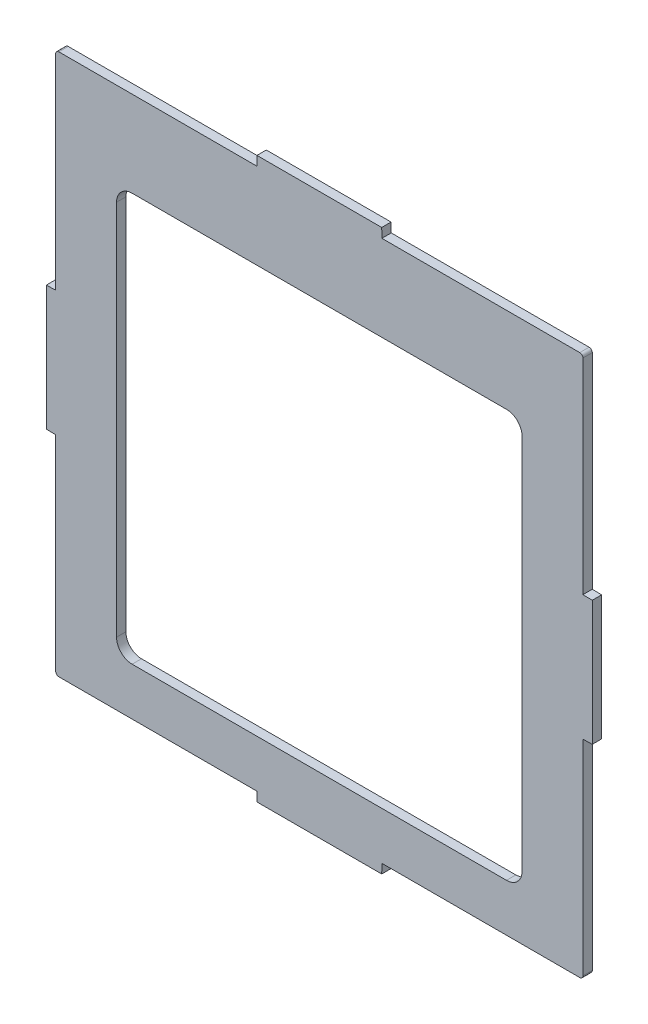
ISO-10303-21;
HEADER;
FILE_DESCRIPTION(('STEP AP214'),'2;1');
FILE_NAME('part.step','',(''),(''),'','','');
FILE_SCHEMA(('AUTOMOTIVE_DESIGN { 1 0 10303 214 1 1 1 1 }'));
ENDSEC;
DATA;
#1=APPLICATION_CONTEXT('core data for automotive mechanical design processes');
#2=APPLICATION_PROTOCOL_DEFINITION('international standard','automotive_design',2000,#1);
#3=PRODUCT_CONTEXT('',#1,'mechanical');
#4=PRODUCT('Part','Part','',(#3));
#5=PRODUCT_RELATED_PRODUCT_CATEGORY('part','',(#4));
#6=PRODUCT_DEFINITION_FORMATION('','',#4);
#7=PRODUCT_DEFINITION_CONTEXT('part definition',#1,'design');
#8=PRODUCT_DEFINITION('design','',#6,#7);
#9=PRODUCT_DEFINITION_SHAPE('','',#8);
#10=(LENGTH_UNIT() NAMED_UNIT(*) SI_UNIT(.MILLI.,.METRE.));
#11=(NAMED_UNIT(*) PLANE_ANGLE_UNIT() SI_UNIT($,.RADIAN.));
#12=(NAMED_UNIT(*) SI_UNIT($,.STERADIAN.) SOLID_ANGLE_UNIT());
#13=UNCERTAINTY_MEASURE_WITH_UNIT(LENGTH_MEASURE(1.E-05),#10,'distance_accuracy_value','');
#14=(GEOMETRIC_REPRESENTATION_CONTEXT(3) GLOBAL_UNCERTAINTY_ASSIGNED_CONTEXT((#13)) GLOBAL_UNIT_ASSIGNED_CONTEXT((#10,
#11,#12)) REPRESENTATION_CONTEXT('',''));
#15=CARTESIAN_POINT('',(0.,0.,0.));
#16=DIRECTION('',(0.,0.,1.));
#17=DIRECTION('',(1.,0.,0.));
#18=AXIS2_PLACEMENT_3D('',#15,#16,#17);
#19=CARTESIAN_POINT('',(739.003337175811,0.,6.));
#20=DIRECTION('',(-1.,0.,0.));
#21=DIRECTION('',(0.,0.,1.));
#22=AXIS2_PLACEMENT_3D('',#19,#20,#21);
#23=PLANE('',#22);
#24=DIRECTION('',(0.,1.,0.));
#25=VECTOR('',#24,1.);
#26=CARTESIAN_POINT('',(739.003337175811,0.,0.));
#27=LINE('',#26,#25);
#28=CARTESIAN_POINT('',(739.003337175811,714.678831377017,0.));
#29=VERTEX_POINT('',#28);
#30=CARTESIAN_POINT('',(739.003337175811,846.078865377017,0.));
#31=VERTEX_POINT('',#30);
#32=EDGE_CURVE('E400',#29,#31,#27,.T.);
#33=ORIENTED_EDGE('',*,*,#32,.T.);
#34=DIRECTION('',(0.,0.,-1.));
#35=VECTOR('',#34,1.);
#36=CARTESIAN_POINT('',(739.003337175811,846.078865377017,6.));
#37=LINE('',#36,#35);
#38=CARTESIAN_POINT('',(739.003337175811,846.078865377017,6.));
#39=VERTEX_POINT('',#38);
#40=EDGE_CURVE('E428',#39,#31,#37,.T.);
#41=ORIENTED_EDGE('',*,*,#40,.F.);
#42=DIRECTION('',(0.,1.,0.));
#43=VECTOR('',#42,1.);
#44=CARTESIAN_POINT('',(739.003337175811,0.,6.));
#45=LINE('',#44,#43);
#46=CARTESIAN_POINT('',(739.003337175811,714.678831377017,6.));
#47=VERTEX_POINT('',#46);
#48=EDGE_CURVE('E334',#47,#39,#45,.T.);
#49=ORIENTED_EDGE('',*,*,#48,.F.);
#50=DIRECTION('',(0.,0.,-1.));
#51=VECTOR('',#50,1.);
#52=CARTESIAN_POINT('',(739.003337175811,714.678831377017,6.));
#53=LINE('',#52,#51);
#54=EDGE_CURVE('E354',#47,#29,#53,.T.);
#55=ORIENTED_EDGE('',*,*,#54,.T.);
#56=EDGE_LOOP('',(#33,#41,#49,#55));
#57=FACE_BOUND('',#56,.T.);
#58=ADVANCED_FACE('F35',(#57),#23,.F.);
#59=CARTESIAN_POINT('',(737.003337175811,846.078865377017,6.));
#60=DIRECTION('',(0.,0.,-1.));
#61=DIRECTION('',(-1.,0.,0.));
#62=AXIS2_PLACEMENT_3D('',#59,#60,#61);
#63=CYLINDRICAL_SURFACE('',#62,2.);
#64=CARTESIAN_POINT('',(737.003337175811,846.078865377017,0.));
#65=DIRECTION('',(0.,0.,1.));
#66=DIRECTION('',(1.,0.,0.));
#67=AXIS2_PLACEMENT_3D('',#64,#65,#66);
#68=CIRCLE('',#67,2.);
#69=CARTESIAN_POINT('',(737.003337175811,848.078865377017,0.));
#70=VERTEX_POINT('',#69);
#71=EDGE_CURVE('E398',#31,#70,#68,.T.);
#72=ORIENTED_EDGE('',*,*,#71,.T.);
#73=DIRECTION('',(0.,0.,-1.));
#74=VECTOR('',#73,1.);
#75=CARTESIAN_POINT('',(737.003337175811,848.078865377017,6.));
#76=LINE('',#75,#74);
#77=CARTESIAN_POINT('',(737.003337175811,848.078865377017,6.));
#78=VERTEX_POINT('',#77);
#79=EDGE_CURVE('E431',#78,#70,#76,.T.);
#80=ORIENTED_EDGE('',*,*,#79,.F.);
#81=CARTESIAN_POINT('',(737.003337175811,846.078865377017,6.));
#82=DIRECTION('',(0.,0.,1.));
#83=DIRECTION('',(1.,0.,0.));
#84=AXIS2_PLACEMENT_3D('',#81,#82,#83);
#85=CIRCLE('',#84,2.);
#86=EDGE_CURVE('E332',#39,#78,#85,.T.);
#87=ORIENTED_EDGE('',*,*,#86,.F.);
#88=ORIENTED_EDGE('',*,*,#40,.T.);
#89=EDGE_LOOP('',(#72,#80,#87,#88));
#90=FACE_BOUND('',#89,.T.);
#91=ADVANCED_FACE('F518',(#90),#63,.T.);
#92=CARTESIAN_POINT('',(0.,848.078865377017,6.));
#93=DIRECTION('',(0.,-1.,0.));
#94=DIRECTION('',(0.,0.,-1.));
#95=AXIS2_PLACEMENT_3D('',#92,#93,#94);
#96=PLANE('',#95);
#97=DIRECTION('',(-1.,0.,0.));
#98=VECTOR('',#97,1.);
#99=CARTESIAN_POINT('',(0.,848.078865377017,0.));
#100=LINE('',#99,#98);
#101=CARTESIAN_POINT('',(610.103337175811,848.078865377017,0.));
#102=VERTEX_POINT('',#101);
#103=EDGE_CURVE('E396',#70,#102,#100,.T.);
#104=ORIENTED_EDGE('',*,*,#103,.T.);
#105=DIRECTION('',(0.,0.,-1.));
#106=VECTOR('',#105,1.);
#107=CARTESIAN_POINT('',(610.103337175811,848.078865377017,6.));
#108=LINE('',#107,#106);
#109=CARTESIAN_POINT('',(610.103337175811,848.078865377017,6.));
#110=VERTEX_POINT('',#109);
#111=EDGE_CURVE('E434',#110,#102,#108,.T.);
#112=ORIENTED_EDGE('',*,*,#111,.F.);
#113=DIRECTION('',(-1.,0.,0.));
#114=VECTOR('',#113,1.);
#115=CARTESIAN_POINT('',(0.,848.078865377017,6.));
#116=LINE('',#115,#114);
#117=EDGE_CURVE('E330',#78,#110,#116,.T.);
#118=ORIENTED_EDGE('',*,*,#117,.F.);
#119=ORIENTED_EDGE('',*,*,#79,.T.);
#120=EDGE_LOOP('',(#104,#112,#118,#119));
#121=FACE_BOUND('',#120,.T.);
#122=ADVANCED_FACE('F523',(#121),#96,.F.);
#123=CARTESIAN_POINT('',(624.064633644969,10.4010772274144,6.));
#124=DIRECTION('',(-0.9998611400396,-0.0166643523339906,0.));
#125=DIRECTION('',(0.0166643523339906,-0.9998611400396,0.));
#126=AXIS2_PLACEMENT_3D('',#123,#124,#125);
#127=PLANE('',#126);
#128=DIRECTION('',(-0.0166643523339906,0.9998611400396,0.));
#129=VECTOR('',#128,1.);
#130=CARTESIAN_POINT('',(624.064633644969,10.4010772274144,0.));
#131=LINE('',#130,#129);
#132=CARTESIAN_POINT('',(610.003337175811,854.078865377017,0.));
#133=VERTEX_POINT('',#132);
#134=EDGE_CURVE('E393',#102,#133,#131,.T.);
#135=ORIENTED_EDGE('',*,*,#134,.T.);
#136=DIRECTION('',(0.,0.,-1.));
#137=VECTOR('',#136,1.);
#138=CARTESIAN_POINT('',(610.003337175811,854.078865377017,6.));
#139=LINE('',#138,#137);
#140=CARTESIAN_POINT('',(610.003337175811,854.078865377017,6.));
#141=VERTEX_POINT('',#140);
#142=EDGE_CURVE('E437',#141,#133,#139,.T.);
#143=ORIENTED_EDGE('',*,*,#142,.F.);
#144=DIRECTION('',(-0.0166643523339906,0.9998611400396,0.));
#145=VECTOR('',#144,1.);
#146=CARTESIAN_POINT('',(624.064633644969,10.4010772274144,6.));
#147=LINE('',#146,#145);
#148=EDGE_CURVE('E328',#110,#141,#147,.T.);
#149=ORIENTED_EDGE('',*,*,#148,.F.);
#150=ORIENTED_EDGE('',*,*,#111,.T.);
#151=EDGE_LOOP('',(#135,#143,#149,#150));
#152=FACE_BOUND('',#151,.T.);
#153=ADVANCED_FACE('F531',(#152),#127,.F.);
#154=CARTESIAN_POINT('',(0.,854.078865377017,6.));
#155=DIRECTION('',(0.,1.,0.));
#156=DIRECTION('',(0.,0.,1.));
#157=AXIS2_PLACEMENT_3D('',#154,#155,#156);
#158=PLANE('',#157);
#159=DIRECTION('',(1.,0.,0.));
#160=VECTOR('',#159,1.);
#161=CARTESIAN_POINT('',(0.,854.078865377017,0.));
#162=LINE('',#161,#160);
#163=CARTESIAN_POINT('',(530.003337175811,854.078865377017,0.));
#164=VERTEX_POINT('',#163);
#165=EDGE_CURVE('E390',#164,#133,#162,.T.);
#166=ORIENTED_EDGE('',*,*,#165,.F.);
#167=DIRECTION('',(0.,0.,-1.));
#168=VECTOR('',#167,1.);
#169=CARTESIAN_POINT('',(530.003337175811,854.078865377017,6.));
#170=LINE('',#169,#168);
#171=CARTESIAN_POINT('',(530.003337175811,854.078865377017,6.));
#172=VERTEX_POINT('',#171);
#173=EDGE_CURVE('E439',#172,#164,#170,.T.);
#174=ORIENTED_EDGE('',*,*,#173,.F.);
#175=DIRECTION('',(1.,0.,0.));
#176=VECTOR('',#175,1.);
#177=CARTESIAN_POINT('',(0.,854.078865377017,6.));
#178=LINE('',#177,#176);
#179=EDGE_CURVE('E325',#172,#141,#178,.T.);
#180=ORIENTED_EDGE('',*,*,#179,.T.);
#181=ORIENTED_EDGE('',*,*,#142,.T.);
#182=EDGE_LOOP('',(#166,#174,#180,#181));
#183=FACE_BOUND('',#182,.T.);
#184=ADVANCED_FACE('F535',(#183),#158,.T.);
#185=CARTESIAN_POINT('',(515.625460125003,-8.59375766877724,6.));
#186=DIRECTION('',(0.999861140039599,-0.016664352334046,0.));
#187=DIRECTION('',(0.016664352334046,0.999861140039599,0.));
#188=AXIS2_PLACEMENT_3D('',#185,#186,#187);
#189=PLANE('',#188);
#190=DIRECTION('',(-0.016664352334046,-0.999861140039599,0.));
#191=VECTOR('',#190,1.);
#192=CARTESIAN_POINT('',(515.625460125003,-8.59375766877724,0.));
#193=LINE('',#192,#191);
#194=CARTESIAN_POINT('',(529.903337175811,848.078865377017,0.));
#195=VERTEX_POINT('',#194);
#196=EDGE_CURVE('E388',#164,#195,#193,.T.);
#197=ORIENTED_EDGE('',*,*,#196,.T.);
#198=DIRECTION('',(0.,0.,-1.));
#199=VECTOR('',#198,1.);
#200=CARTESIAN_POINT('',(529.903337175811,848.078865377017,6.));
#201=LINE('',#200,#199);
#202=CARTESIAN_POINT('',(529.903337175811,848.078865377017,6.));
#203=VERTEX_POINT('',#202);
#204=EDGE_CURVE('E441',#203,#195,#201,.T.);
#205=ORIENTED_EDGE('',*,*,#204,.F.);
#206=DIRECTION('',(-0.016664352334046,-0.999861140039599,0.));
#207=VECTOR('',#206,1.);
#208=CARTESIAN_POINT('',(515.625460125003,-8.59375766877724,6.));
#209=LINE('',#208,#207);
#210=EDGE_CURVE('E323',#172,#203,#209,.T.);
#211=ORIENTED_EDGE('',*,*,#210,.F.);
#212=ORIENTED_EDGE('',*,*,#173,.T.);
#213=EDGE_LOOP('',(#197,#205,#211,#212));
#214=FACE_BOUND('',#213,.T.);
#215=ADVANCED_FACE('F539',(#214),#189,.F.);
#216=CARTESIAN_POINT('',(0.,848.078865377017,6.));
#217=DIRECTION('',(0.,-1.,0.));
#218=DIRECTION('',(0.,0.,-1.));
#219=AXIS2_PLACEMENT_3D('',#216,#217,#218);
#220=PLANE('',#219);
#221=DIRECTION('',(-1.,0.,0.));
#222=VECTOR('',#221,1.);
#223=CARTESIAN_POINT('',(0.,848.078865377017,0.));
#224=LINE('',#223,#222);
#225=CARTESIAN_POINT('',(403.003337175811,848.078865377017,0.));
#226=VERTEX_POINT('',#225);
#227=EDGE_CURVE('E386',#195,#226,#224,.T.);
#228=ORIENTED_EDGE('',*,*,#227,.T.);
#229=DIRECTION('',(0.,0.,-1.));
#230=VECTOR('',#229,1.);
#231=CARTESIAN_POINT('',(403.003337175811,848.078865377017,6.));
#232=LINE('',#231,#230);
#233=CARTESIAN_POINT('',(403.003337175811,848.078865377017,6.));
#234=VERTEX_POINT('',#233);
#235=EDGE_CURVE('E444',#234,#226,#232,.T.);
#236=ORIENTED_EDGE('',*,*,#235,.F.);
#237=DIRECTION('',(-1.,0.,0.));
#238=VECTOR('',#237,1.);
#239=CARTESIAN_POINT('',(0.,848.078865377017,6.));
#240=LINE('',#239,#238);
#241=EDGE_CURVE('E321',#203,#234,#240,.T.);
#242=ORIENTED_EDGE('',*,*,#241,.F.);
#243=ORIENTED_EDGE('',*,*,#204,.T.);
#244=EDGE_LOOP('',(#228,#236,#242,#243));
#245=FACE_BOUND('',#244,.T.);
#246=ADVANCED_FACE('F543',(#245),#220,.F.);
#247=CARTESIAN_POINT('',(403.003337175811,846.078865377017,6.));
#248=DIRECTION('',(0.,0.,-1.));
#249=DIRECTION('',(-1.,0.,0.));
#250=AXIS2_PLACEMENT_3D('',#247,#248,#249);
#251=CYLINDRICAL_SURFACE('',#250,2.00000000000003);
#252=CARTESIAN_POINT('',(403.003337175811,846.078865377017,0.));
#253=DIRECTION('',(0.,0.,1.));
#254=DIRECTION('',(1.,0.,0.));
#255=AXIS2_PLACEMENT_3D('',#252,#253,#254);
#256=CIRCLE('',#255,2.00000000000003);
#257=CARTESIAN_POINT('',(401.003337175811,846.078865377017,0.));
#258=VERTEX_POINT('',#257);
#259=EDGE_CURVE('E384',#226,#258,#256,.T.);
#260=ORIENTED_EDGE('',*,*,#259,.T.);
#261=DIRECTION('',(0.,0.,-1.));
#262=VECTOR('',#261,1.);
#263=CARTESIAN_POINT('',(401.003337175811,846.078865377017,6.));
#264=LINE('',#263,#262);
#265=CARTESIAN_POINT('',(401.003337175811,846.078865377017,6.));
#266=VERTEX_POINT('',#265);
#267=EDGE_CURVE('E447',#266,#258,#264,.T.);
#268=ORIENTED_EDGE('',*,*,#267,.F.);
#269=CARTESIAN_POINT('',(403.003337175811,846.078865377017,6.));
#270=DIRECTION('',(0.,0.,1.));
#271=DIRECTION('',(1.,0.,0.));
#272=AXIS2_PLACEMENT_3D('',#269,#270,#271);
#273=CIRCLE('',#272,2.00000000000003);
#274=EDGE_CURVE('E319',#234,#266,#273,.T.);
#275=ORIENTED_EDGE('',*,*,#274,.F.);
#276=ORIENTED_EDGE('',*,*,#235,.T.);
#277=EDGE_LOOP('',(#260,#268,#275,#276));
#278=FACE_BOUND('',#277,.T.);
#279=ADVANCED_FACE('F547',(#278),#251,.T.);
#280=CARTESIAN_POINT('',(401.003337175811,0.,6.));
#281=DIRECTION('',(1.,0.,0.));
#282=DIRECTION('',(0.,0.,-1.));
#283=AXIS2_PLACEMENT_3D('',#280,#281,#282);
#284=PLANE('',#283);
#285=DIRECTION('',(0.,-1.,0.));
#286=VECTOR('',#285,1.);
#287=CARTESIAN_POINT('',(401.003337175811,0.,0.));
#288=LINE('',#287,#286);
#289=CARTESIAN_POINT('',(401.003337175811,714.678831377017,0.));
#290=VERTEX_POINT('',#289);
#291=EDGE_CURVE('E382',#258,#290,#288,.T.);
#292=ORIENTED_EDGE('',*,*,#291,.T.);
#293=DIRECTION('',(0.,0.,-1.));
#294=VECTOR('',#293,1.);
#295=CARTESIAN_POINT('',(401.003337175811,714.678831377017,6.));
#296=LINE('',#295,#294);
#297=CARTESIAN_POINT('',(401.003337175811,714.678831377017,6.));
#298=VERTEX_POINT('',#297);
#299=EDGE_CURVE('E450',#298,#290,#296,.T.);
#300=ORIENTED_EDGE('',*,*,#299,.F.);
#301=DIRECTION('',(0.,-1.,0.));
#302=VECTOR('',#301,1.);
#303=CARTESIAN_POINT('',(401.003337175811,0.,6.));
#304=LINE('',#303,#302);
#305=EDGE_CURVE('E317',#266,#298,#304,.T.);
#306=ORIENTED_EDGE('',*,*,#305,.F.);
#307=ORIENTED_EDGE('',*,*,#267,.T.);
#308=EDGE_LOOP('',(#292,#300,#306,#307));
#309=FACE_BOUND('',#308,.T.);
#310=ADVANCED_FACE('F551',(#309),#284,.F.);
#311=CARTESIAN_POINT('',(-11.7966471939575,707.798831637521,6.));
#312=DIRECTION('',(0.0166643523339916,-0.9998611400396,0.));
#313=DIRECTION('',(0.9998611400396,0.0166643523339916,0.));
#314=AXIS2_PLACEMENT_3D('',#311,#312,#313);
#315=PLANE('',#314);
#316=DIRECTION('',(-0.9998611400396,-0.0166643523339916,0.));
#317=VECTOR('',#316,1.);
#318=CARTESIAN_POINT('',(-11.7966471939575,707.798831637521,0.));
#319=LINE('',#318,#317);
#320=CARTESIAN_POINT('',(395.003337175811,714.578831377017,0.));
#321=VERTEX_POINT('',#320);
#322=EDGE_CURVE('E380',#290,#321,#319,.T.);
#323=ORIENTED_EDGE('',*,*,#322,.T.);
#324=DIRECTION('',(0.,0.,-1.));
#325=VECTOR('',#324,1.);
#326=CARTESIAN_POINT('',(395.003337175811,714.578831377017,6.));
#327=LINE('',#326,#325);
#328=CARTESIAN_POINT('',(395.003337175811,714.578831377017,6.));
#329=VERTEX_POINT('',#328);
#330=EDGE_CURVE('E453',#329,#321,#327,.T.);
#331=ORIENTED_EDGE('',*,*,#330,.F.);
#332=DIRECTION('',(-0.9998611400396,-0.0166643523339916,0.));
#333=VECTOR('',#332,1.);
#334=CARTESIAN_POINT('',(-11.7966471939575,707.798831637521,6.));
#335=LINE('',#334,#333);
#336=EDGE_CURVE('E315',#298,#329,#335,.T.);
#337=ORIENTED_EDGE('',*,*,#336,.F.);
#338=ORIENTED_EDGE('',*,*,#299,.T.);
#339=EDGE_LOOP('',(#323,#331,#337,#338));
#340=FACE_BOUND('',#339,.T.);
#341=ADVANCED_FACE('F555',(#340),#315,.F.);
#342=CARTESIAN_POINT('',(395.003337175811,0.,6.));
#343=DIRECTION('',(1.,0.,0.));
#344=DIRECTION('',(0.,0.,-1.));
#345=AXIS2_PLACEMENT_3D('',#342,#343,#344);
#346=PLANE('',#345);
#347=DIRECTION('',(0.,-1.,0.));
#348=VECTOR('',#347,1.);
#349=CARTESIAN_POINT('',(395.003337175811,0.,0.));
#350=LINE('',#349,#348);
#351=CARTESIAN_POINT('',(395.003337175812,634.578831377017,0.));
#352=VERTEX_POINT('',#351);
#353=EDGE_CURVE('E378',#321,#352,#350,.T.);
#354=ORIENTED_EDGE('',*,*,#353,.T.);
#355=DIRECTION('',(0.,0.,-1.));
#356=VECTOR('',#355,1.);
#357=CARTESIAN_POINT('',(395.003337175812,634.578831377017,6.));
#358=LINE('',#357,#356);
#359=CARTESIAN_POINT('',(395.003337175812,634.578831377017,6.));
#360=VERTEX_POINT('',#359);
#361=EDGE_CURVE('E456',#360,#352,#358,.T.);
#362=ORIENTED_EDGE('',*,*,#361,.F.);
#363=DIRECTION('',(0.,-1.,0.));
#364=VECTOR('',#363,1.);
#365=CARTESIAN_POINT('',(395.003337175811,0.,6.));
#366=LINE('',#365,#364);
#367=EDGE_CURVE('E313',#329,#360,#366,.T.);
#368=ORIENTED_EDGE('',*,*,#367,.F.);
#369=ORIENTED_EDGE('',*,*,#330,.T.);
#370=EDGE_LOOP('',(#354,#362,#368,#369));
#371=FACE_BOUND('',#370,.T.);
#372=ADVANCED_FACE('F559',(#371),#346,.F.);
#373=CARTESIAN_POINT('',(10.6830694861963,640.984169171843,6.));
#374=DIRECTION('',(0.0166643523339916,0.9998611400396,0.));
#375=DIRECTION('',(-0.9998611400396,0.0166643523339916,0.));
#376=AXIS2_PLACEMENT_3D('',#373,#374,#375);
#377=PLANE('',#376);
#378=DIRECTION('',(0.9998611400396,-0.0166643523339916,0.));
#379=VECTOR('',#378,1.);
#380=CARTESIAN_POINT('',(10.6830694861963,640.984169171843,0.));
#381=LINE('',#380,#379);
#382=CARTESIAN_POINT('',(401.003337175811,634.478831377017,0.));
#383=VERTEX_POINT('',#382);
#384=EDGE_CURVE('E376',#352,#383,#381,.T.);
#385=ORIENTED_EDGE('',*,*,#384,.T.);
#386=DIRECTION('',(0.,0.,-1.));
#387=VECTOR('',#386,1.);
#388=CARTESIAN_POINT('',(401.003337175811,634.478831377017,6.));
#389=LINE('',#388,#387);
#390=CARTESIAN_POINT('',(401.003337175811,634.478831377017,6.));
#391=VERTEX_POINT('',#390);
#392=EDGE_CURVE('E459',#391,#383,#389,.T.);
#393=ORIENTED_EDGE('',*,*,#392,.F.);
#394=DIRECTION('',(0.9998611400396,-0.0166643523339916,0.));
#395=VECTOR('',#394,1.);
#396=CARTESIAN_POINT('',(10.6830694861963,640.984169171843,6.));
#397=LINE('',#396,#395);
#398=EDGE_CURVE('E311',#360,#391,#397,.T.);
#399=ORIENTED_EDGE('',*,*,#398,.F.);
#400=ORIENTED_EDGE('',*,*,#361,.T.);
#401=EDGE_LOOP('',(#385,#393,#399,#400));
#402=FACE_BOUND('',#401,.T.);
#403=ADVANCED_FACE('F563',(#402),#377,.F.);
#404=CARTESIAN_POINT('',(401.003337175811,0.,6.));
#405=DIRECTION('',(1.,0.,0.));
#406=DIRECTION('',(0.,0.,-1.));
#407=AXIS2_PLACEMENT_3D('',#404,#405,#406);
#408=PLANE('',#407);
#409=DIRECTION('',(0.,-1.,0.));
#410=VECTOR('',#409,1.);
#411=CARTESIAN_POINT('',(401.003337175811,0.,0.));
#412=LINE('',#411,#410);
#413=CARTESIAN_POINT('',(401.003337175811,503.078865377017,0.));
#414=VERTEX_POINT('',#413);
#415=EDGE_CURVE('E374',#383,#414,#412,.T.);
#416=ORIENTED_EDGE('',*,*,#415,.T.);
#417=DIRECTION('',(0.,0.,-1.));
#418=VECTOR('',#417,1.);
#419=CARTESIAN_POINT('',(401.003337175811,503.078865377017,6.));
#420=LINE('',#419,#418);
#421=CARTESIAN_POINT('',(401.003337175811,503.078865377017,6.));
#422=VERTEX_POINT('',#421);
#423=EDGE_CURVE('E462',#422,#414,#420,.T.);
#424=ORIENTED_EDGE('',*,*,#423,.F.);
#425=DIRECTION('',(0.,-1.,0.));
#426=VECTOR('',#425,1.);
#427=CARTESIAN_POINT('',(401.003337175811,0.,6.));
#428=LINE('',#427,#426);
#429=EDGE_CURVE('E309',#391,#422,#428,.T.);
#430=ORIENTED_EDGE('',*,*,#429,.F.);
#431=ORIENTED_EDGE('',*,*,#392,.T.);
#432=EDGE_LOOP('',(#416,#424,#430,#431));
#433=FACE_BOUND('',#432,.T.);
#434=ADVANCED_FACE('F567',(#433),#408,.F.);
#435=CARTESIAN_POINT('',(403.003337175811,503.078865377017,6.));
#436=DIRECTION('',(0.,0.,-1.));
#437=DIRECTION('',(-1.,0.,0.));
#438=AXIS2_PLACEMENT_3D('',#435,#436,#437);
#439=CYLINDRICAL_SURFACE('',#438,2.);
#440=CARTESIAN_POINT('',(403.003337175811,503.078865377017,0.));
#441=DIRECTION('',(0.,0.,1.));
#442=DIRECTION('',(1.,0.,0.));
#443=AXIS2_PLACEMENT_3D('',#440,#441,#442);
#444=CIRCLE('',#443,2.);
#445=CARTESIAN_POINT('',(403.003337175811,501.078865377017,0.));
#446=VERTEX_POINT('',#445);
#447=EDGE_CURVE('E372',#414,#446,#444,.T.);
#448=ORIENTED_EDGE('',*,*,#447,.T.);
#449=DIRECTION('',(0.,0.,-1.));
#450=VECTOR('',#449,1.);
#451=CARTESIAN_POINT('',(403.003337175811,501.078865377017,6.));
#452=LINE('',#451,#450);
#453=CARTESIAN_POINT('',(403.003337175811,501.078865377017,6.));
#454=VERTEX_POINT('',#453);
#455=EDGE_CURVE('E465',#454,#446,#452,.T.);
#456=ORIENTED_EDGE('',*,*,#455,.F.);
#457=CARTESIAN_POINT('',(403.003337175811,503.078865377017,6.));
#458=DIRECTION('',(0.,0.,1.));
#459=DIRECTION('',(1.,0.,0.));
#460=AXIS2_PLACEMENT_3D('',#457,#458,#459);
#461=CIRCLE('',#460,2.);
#462=EDGE_CURVE('E307',#422,#454,#461,.T.);
#463=ORIENTED_EDGE('',*,*,#462,.F.);
#464=ORIENTED_EDGE('',*,*,#423,.T.);
#465=EDGE_LOOP('',(#448,#456,#463,#464));
#466=FACE_BOUND('',#465,.T.);
#467=ADVANCED_FACE('F571',(#466),#439,.T.);
#468=CARTESIAN_POINT('',(0.,501.078865377017,6.));
#469=DIRECTION('',(0.,1.,0.));
#470=DIRECTION('',(0.,0.,1.));
#471=AXIS2_PLACEMENT_3D('',#468,#469,#470);
#472=PLANE('',#471);
#473=DIRECTION('',(1.,0.,0.));
#474=VECTOR('',#473,1.);
#475=CARTESIAN_POINT('',(0.,501.078865377017,0.));
#476=LINE('',#475,#474);
#477=CARTESIAN_POINT('',(529.903337175811,501.078865377017,0.));
#478=VERTEX_POINT('',#477);
#479=EDGE_CURVE('E370',#446,#478,#476,.T.);
#480=ORIENTED_EDGE('',*,*,#479,.T.);
#481=DIRECTION('',(0.,0.,-1.));
#482=VECTOR('',#481,1.);
#483=CARTESIAN_POINT('',(529.903337175811,501.078865377017,6.));
#484=LINE('',#483,#482);
#485=CARTESIAN_POINT('',(529.903337175811,501.078865377017,6.));
#486=VERTEX_POINT('',#485);
#487=EDGE_CURVE('E468',#486,#478,#484,.T.);
#488=ORIENTED_EDGE('',*,*,#487,.F.);
#489=DIRECTION('',(1.,0.,0.));
#490=VECTOR('',#489,1.);
#491=CARTESIAN_POINT('',(0.,501.078865377017,6.));
#492=LINE('',#491,#490);
#493=EDGE_CURVE('E305',#454,#486,#492,.T.);
#494=ORIENTED_EDGE('',*,*,#493,.F.);
#495=ORIENTED_EDGE('',*,*,#455,.T.);
#496=EDGE_LOOP('',(#480,#488,#494,#495));
#497=FACE_BOUND('',#496,.T.);
#498=ADVANCED_FACE('F575',(#497),#472,.F.);
#499=CARTESIAN_POINT('',(538.105177938249,8.96841963233311,6.));
#500=DIRECTION('',(0.999861140039599,0.0166643523340471,0.));
#501=DIRECTION('',(-0.0166643523340471,0.999861140039599,0.));
#502=AXIS2_PLACEMENT_3D('',#499,#500,#501);
#503=PLANE('',#502);
#504=DIRECTION('',(0.0166643523340471,-0.999861140039599,0.));
#505=VECTOR('',#504,1.);
#506=CARTESIAN_POINT('',(538.105177938249,8.96841963233311,0.));
#507=LINE('',#506,#505);
#508=CARTESIAN_POINT('',(530.003337175811,495.078865377017,0.));
#509=VERTEX_POINT('',#508);
#510=EDGE_CURVE('E368',#478,#509,#507,.T.);
#511=ORIENTED_EDGE('',*,*,#510,.T.);
#512=DIRECTION('',(0.,0.,-1.));
#513=VECTOR('',#512,1.);
#514=CARTESIAN_POINT('',(530.003337175811,495.078865377017,6.));
#515=LINE('',#514,#513);
#516=CARTESIAN_POINT('',(530.003337175811,495.078865377017,6.));
#517=VERTEX_POINT('',#516);
#518=EDGE_CURVE('E471',#517,#509,#515,.T.);
#519=ORIENTED_EDGE('',*,*,#518,.F.);
#520=DIRECTION('',(0.0166643523340471,-0.999861140039599,0.));
#521=VECTOR('',#520,1.);
#522=CARTESIAN_POINT('',(538.105177938249,8.96841963233311,6.));
#523=LINE('',#522,#521);
#524=EDGE_CURVE('E303',#486,#517,#523,.T.);
#525=ORIENTED_EDGE('',*,*,#524,.F.);
#526=ORIENTED_EDGE('',*,*,#487,.T.);
#527=EDGE_LOOP('',(#511,#519,#525,#526));
#528=FACE_BOUND('',#527,.T.);
#529=ADVANCED_FACE('F579',(#528),#503,.F.);
#530=CARTESIAN_POINT('',(0.,495.078865377017,6.));
#531=DIRECTION('',(0.,1.,0.));
#532=DIRECTION('',(0.,0.,1.));
#533=AXIS2_PLACEMENT_3D('',#530,#531,#532);
#534=PLANE('',#533);
#535=DIRECTION('',(1.,0.,0.));
#536=VECTOR('',#535,1.);
#537=CARTESIAN_POINT('',(0.,495.078865377017,0.));
#538=LINE('',#537,#536);
#539=CARTESIAN_POINT('',(610.003337175811,495.078865377017,0.));
#540=VERTEX_POINT('',#539);
#541=EDGE_CURVE('E366',#509,#540,#538,.T.);
#542=ORIENTED_EDGE('',*,*,#541,.T.);
#543=DIRECTION('',(0.,0.,-1.));
#544=VECTOR('',#543,1.);
#545=CARTESIAN_POINT('',(610.003337175811,495.078865377017,6.));
#546=LINE('',#545,#544);
#547=CARTESIAN_POINT('',(610.003337175811,495.078865377017,6.));
#548=VERTEX_POINT('',#547);
#549=EDGE_CURVE('E474',#548,#540,#546,.T.);
#550=ORIENTED_EDGE('',*,*,#549,.F.);
#551=DIRECTION('',(1.,0.,0.));
#552=VECTOR('',#551,1.);
#553=CARTESIAN_POINT('',(0.,495.078865377017,6.));
#554=LINE('',#553,#552);
#555=EDGE_CURVE('E301',#517,#548,#554,.T.);
#556=ORIENTED_EDGE('',*,*,#555,.F.);
#557=ORIENTED_EDGE('',*,*,#518,.T.);
#558=EDGE_LOOP('',(#542,#550,#556,#557));
#559=FACE_BOUND('',#558,.T.);
#560=ADVANCED_FACE('F583',(#559),#534,.F.);
#561=CARTESIAN_POINT('',(601.584915831797,-10.0264152638623,6.));
#562=DIRECTION('',(-0.9998611400396,0.0166643523339916,0.));
#563=DIRECTION('',(-0.0166643523339916,-0.9998611400396,0.));
#564=AXIS2_PLACEMENT_3D('',#561,#562,#563);
#565=PLANE('',#564);
#566=DIRECTION('',(0.0166643523339916,0.9998611400396,0.));
#567=VECTOR('',#566,1.);
#568=CARTESIAN_POINT('',(601.584915831797,-10.0264152638623,0.));
#569=LINE('',#568,#567);
#570=CARTESIAN_POINT('',(610.103337175811,501.078865377017,0.));
#571=VERTEX_POINT('',#570);
#572=EDGE_CURVE('E364',#540,#571,#569,.T.);
#573=ORIENTED_EDGE('',*,*,#572,.T.);
#574=DIRECTION('',(0.,0.,-1.));
#575=VECTOR('',#574,1.);
#576=CARTESIAN_POINT('',(610.103337175811,501.078865377017,6.));
#577=LINE('',#576,#575);
#578=CARTESIAN_POINT('',(610.103337175811,501.078865377017,6.));
#579=VERTEX_POINT('',#578);
#580=EDGE_CURVE('E477',#579,#571,#577,.T.);
#581=ORIENTED_EDGE('',*,*,#580,.F.);
#582=DIRECTION('',(0.0166643523339916,0.9998611400396,0.));
#583=VECTOR('',#582,1.);
#584=CARTESIAN_POINT('',(601.584915831797,-10.0264152638623,6.));
#585=LINE('',#584,#583);
#586=EDGE_CURVE('E299',#548,#579,#585,.T.);
#587=ORIENTED_EDGE('',*,*,#586,.F.);
#588=ORIENTED_EDGE('',*,*,#549,.T.);
#589=EDGE_LOOP('',(#573,#581,#587,#588));
#590=FACE_BOUND('',#589,.T.);
#591=ADVANCED_FACE('F587',(#590),#565,.F.);
#592=CARTESIAN_POINT('',(0.,501.078865377017,6.));
#593=DIRECTION('',(0.,1.,0.));
#594=DIRECTION('',(0.,0.,1.));
#595=AXIS2_PLACEMENT_3D('',#592,#593,#594);
#596=PLANE('',#595);
#597=DIRECTION('',(1.,0.,0.));
#598=VECTOR('',#597,1.);
#599=CARTESIAN_POINT('',(0.,501.078865377017,0.));
#600=LINE('',#599,#598);
#601=CARTESIAN_POINT('',(737.003337175811,501.078865377017,0.));
#602=VERTEX_POINT('',#601);
#603=EDGE_CURVE('E362',#571,#602,#600,.T.);
#604=ORIENTED_EDGE('',*,*,#603,.T.);
#605=DIRECTION('',(0.,0.,-1.));
#606=VECTOR('',#605,1.);
#607=CARTESIAN_POINT('',(737.003337175811,501.078865377017,6.));
#608=LINE('',#607,#606);
#609=CARTESIAN_POINT('',(737.003337175811,501.078865377017,6.));
#610=VERTEX_POINT('',#609);
#611=EDGE_CURVE('E480',#610,#602,#608,.T.);
#612=ORIENTED_EDGE('',*,*,#611,.F.);
#613=DIRECTION('',(1.,0.,0.));
#614=VECTOR('',#613,1.);
#615=CARTESIAN_POINT('',(0.,501.078865377017,6.));
#616=LINE('',#615,#614);
#617=EDGE_CURVE('E297',#579,#610,#616,.T.);
#618=ORIENTED_EDGE('',*,*,#617,.F.);
#619=ORIENTED_EDGE('',*,*,#580,.T.);
#620=EDGE_LOOP('',(#604,#612,#618,#619));
#621=FACE_BOUND('',#620,.T.);
#622=ADVANCED_FACE('F591',(#621),#596,.F.);
#623=CARTESIAN_POINT('',(737.003337175811,503.078865377017,6.));
#624=DIRECTION('',(0.,0.,-1.));
#625=DIRECTION('',(-1.,0.,0.));
#626=AXIS2_PLACEMENT_3D('',#623,#624,#625);
#627=CYLINDRICAL_SURFACE('',#626,2.);
#628=CARTESIAN_POINT('',(737.003337175811,503.078865377017,0.));
#629=DIRECTION('',(0.,0.,1.));
#630=DIRECTION('',(1.,0.,0.));
#631=AXIS2_PLACEMENT_3D('',#628,#629,#630);
#632=CIRCLE('',#631,2.);
#633=CARTESIAN_POINT('',(739.003337175811,503.078865377017,0.));
#634=VERTEX_POINT('',#633);
#635=EDGE_CURVE('E360',#602,#634,#632,.T.);
#636=ORIENTED_EDGE('',*,*,#635,.T.);
#637=DIRECTION('',(0.,0.,-1.));
#638=VECTOR('',#637,1.);
#639=CARTESIAN_POINT('',(739.003337175811,503.078865377017,6.));
#640=LINE('',#639,#638);
#641=CARTESIAN_POINT('',(739.003337175811,503.078865377017,6.));
#642=VERTEX_POINT('',#641);
#643=EDGE_CURVE('E483',#642,#634,#640,.T.);
#644=ORIENTED_EDGE('',*,*,#643,.F.);
#645=CARTESIAN_POINT('',(737.003337175811,503.078865377017,6.));
#646=DIRECTION('',(0.,0.,1.));
#647=DIRECTION('',(1.,0.,0.));
#648=AXIS2_PLACEMENT_3D('',#645,#646,#647);
#649=CIRCLE('',#648,2.);
#650=EDGE_CURVE('E295',#610,#642,#649,.T.);
#651=ORIENTED_EDGE('',*,*,#650,.F.);
#652=ORIENTED_EDGE('',*,*,#611,.T.);
#653=EDGE_LOOP('',(#636,#644,#651,#652));
#654=FACE_BOUND('',#653,.T.);
#655=ADVANCED_FACE('F595',(#654),#627,.T.);
#656=CARTESIAN_POINT('',(739.003337175811,0.,6.));
#657=DIRECTION('',(-1.,0.,0.));
#658=DIRECTION('',(0.,0.,1.));
#659=AXIS2_PLACEMENT_3D('',#656,#657,#658);
#660=PLANE('',#659);
#661=DIRECTION('',(0.,1.,0.));
#662=VECTOR('',#661,1.);
#663=CARTESIAN_POINT('',(739.003337175811,0.,0.));
#664=LINE('',#663,#662);
#665=CARTESIAN_POINT('',(739.003337175811,634.478831377017,0.));
#666=VERTEX_POINT('',#665);
#667=EDGE_CURVE('E358',#634,#666,#664,.T.);
#668=ORIENTED_EDGE('',*,*,#667,.T.);
#669=DIRECTION('',(0.,0.,-1.));
#670=VECTOR('',#669,1.);
#671=CARTESIAN_POINT('',(739.003337175811,634.478831377017,6.));
#672=LINE('',#671,#670);
#673=CARTESIAN_POINT('',(739.003337175811,634.478831377017,6.));
#674=VERTEX_POINT('',#673);
#675=EDGE_CURVE('E486',#674,#666,#672,.T.);
#676=ORIENTED_EDGE('',*,*,#675,.F.);
#677=DIRECTION('',(0.,1.,0.));
#678=VECTOR('',#677,1.);
#679=CARTESIAN_POINT('',(739.003337175811,0.,6.));
#680=LINE('',#679,#678);
#681=EDGE_CURVE('E293',#642,#674,#680,.T.);
#682=ORIENTED_EDGE('',*,*,#681,.F.);
#683=ORIENTED_EDGE('',*,*,#643,.T.);
#684=EDGE_LOOP('',(#668,#676,#682,#683));
#685=FACE_BOUND('',#684,.T.);
#686=ADVANCED_FACE('F599',(#685),#660,.F.);
#687=CARTESIAN_POINT('',(-10.3664889045935,621.989334275678,6.));
#688=DIRECTION('',(-0.0166643523339915,0.9998611400396,0.));
#689=DIRECTION('',(-0.9998611400396,-0.0166643523339915,0.));
#690=AXIS2_PLACEMENT_3D('',#687,#688,#689);
#691=PLANE('',#690);
#692=DIRECTION('',(0.9998611400396,0.0166643523339915,0.));
#693=VECTOR('',#692,1.);
#694=CARTESIAN_POINT('',(-10.3664889045935,621.989334275678,0.));
#695=LINE('',#694,#693);
#696=CARTESIAN_POINT('',(745.003337175811,634.578831377017,0.));
#697=VERTEX_POINT('',#696);
#698=EDGE_CURVE('E351',#666,#697,#695,.T.);
#699=ORIENTED_EDGE('',*,*,#698,.T.);
#700=DIRECTION('',(0.,0.,-1.));
#701=VECTOR('',#700,1.);
#702=CARTESIAN_POINT('',(745.003337175811,634.578831377017,6.));
#703=LINE('',#702,#701);
#704=CARTESIAN_POINT('',(745.003337175811,634.578831377017,6.));
#705=VERTEX_POINT('',#704);
#706=EDGE_CURVE('E489',#705,#697,#703,.T.);
#707=ORIENTED_EDGE('',*,*,#706,.F.);
#708=DIRECTION('',(0.9998611400396,0.0166643523339915,0.));
#709=VECTOR('',#708,1.);
#710=CARTESIAN_POINT('',(-10.3664889045935,621.989334275678,6.));
#711=LINE('',#710,#709);
#712=EDGE_CURVE('E291',#674,#705,#711,.T.);
#713=ORIENTED_EDGE('',*,*,#712,.F.);
#714=ORIENTED_EDGE('',*,*,#675,.T.);
#715=EDGE_LOOP('',(#699,#707,#713,#714));
#716=FACE_BOUND('',#715,.T.);
#717=ADVANCED_FACE('F603',(#716),#691,.F.);
#718=CARTESIAN_POINT('',(745.003337175811,0.,6.));
#719=DIRECTION('',(-1.,0.,0.));
#720=DIRECTION('',(0.,0.,1.));
#721=AXIS2_PLACEMENT_3D('',#718,#719,#720);
#722=PLANE('',#721);
#723=DIRECTION('',(0.,1.,0.));
#724=VECTOR('',#723,1.);
#725=CARTESIAN_POINT('',(745.003337175811,0.,0.));
#726=LINE('',#725,#724);
#727=CARTESIAN_POINT('',(745.003337175811,714.578831377017,0.));
#728=VERTEX_POINT('',#727);
#729=EDGE_CURVE('E349',#697,#728,#726,.T.);
#730=ORIENTED_EDGE('',*,*,#729,.T.);
#731=DIRECTION('',(0.,0.,-1.));
#732=VECTOR('',#731,1.);
#733=CARTESIAN_POINT('',(745.003337175811,714.578831377017,6.));
#734=LINE('',#733,#732);
#735=CARTESIAN_POINT('',(745.003337175811,714.578831377017,6.));
#736=VERTEX_POINT('',#735);
#737=EDGE_CURVE('E491',#736,#728,#734,.T.);
#738=ORIENTED_EDGE('',*,*,#737,.F.);
#739=DIRECTION('',(0.,1.,0.));
#740=VECTOR('',#739,1.);
#741=CARTESIAN_POINT('',(745.003337175811,0.,6.));
#742=LINE('',#741,#740);
#743=EDGE_CURVE('E288',#705,#736,#742,.T.);
#744=ORIENTED_EDGE('',*,*,#743,.F.);
#745=ORIENTED_EDGE('',*,*,#706,.T.);
#746=EDGE_LOOP('',(#730,#738,#744,#745));
#747=FACE_BOUND('',#746,.T.);
#748=ADVANCED_FACE('F515',(#747),#722,.F.);
#749=CARTESIAN_POINT('',(690.003337175811,783.078865377017,6.));
#750=DIRECTION('',(0.,0.,-1.));
#751=DIRECTION('',(-1.,0.,0.));
#752=AXIS2_PLACEMENT_3D('',#749,#750,#751);
#753=CYLINDRICAL_SURFACE('',#752,10.);
#754=CARTESIAN_POINT('',(690.003337175811,783.078865377017,0.));
#755=DIRECTION('',(0.,0.,1.));
#756=DIRECTION('',(1.,0.,0.));
#757=AXIS2_PLACEMENT_3D('',#754,#755,#756);
#758=CIRCLE('',#757,10.);
#759=CARTESIAN_POINT('',(700.003337175811,783.078865377017,0.));
#760=VERTEX_POINT('',#759);
#761=CARTESIAN_POINT('',(690.003337175811,793.078865377017,0.));
#762=VERTEX_POINT('',#761);
#763=EDGE_CURVE('E11',#760,#762,#758,.T.);
#764=ORIENTED_EDGE('',*,*,#763,.F.);
#765=DIRECTION('',(0.,0.,-1.));
#766=VECTOR('',#765,1.);
#767=CARTESIAN_POINT('',(700.003337175811,783.078865377017,6.));
#768=LINE('',#767,#766);
#769=CARTESIAN_POINT('',(700.003337175811,783.078865377017,6.));
#770=VERTEX_POINT('',#769);
#771=EDGE_CURVE('E54',#770,#760,#768,.T.);
#772=ORIENTED_EDGE('',*,*,#771,.F.);
#773=CARTESIAN_POINT('',(690.003337175811,783.078865377017,6.));
#774=DIRECTION('',(0.,0.,1.));
#775=DIRECTION('',(1.,0.,0.));
#776=AXIS2_PLACEMENT_3D('',#773,#774,#775);
#777=CIRCLE('',#776,10.);
#778=CARTESIAN_POINT('',(690.003337175811,793.078865377017,6.));
#779=VERTEX_POINT('',#778);
#780=EDGE_CURVE('E39',#770,#779,#777,.T.);
#781=ORIENTED_EDGE('',*,*,#780,.T.);
#782=DIRECTION('',(0.,0.,-1.));
#783=VECTOR('',#782,1.);
#784=CARTESIAN_POINT('',(690.003337175811,793.078865377017,6.));
#785=LINE('',#784,#783);
#786=EDGE_CURVE('E289',#779,#762,#785,.T.);
#787=ORIENTED_EDGE('',*,*,#786,.T.);
#788=EDGE_LOOP('',(#764,#772,#781,#787));
#789=FACE_BOUND('',#788,.T.);
#790=ADVANCED_FACE('F506',(#789),#753,.F.);
#791=CARTESIAN_POINT('',(700.003337175811,0.,6.));
#792=DIRECTION('',(1.,0.,0.));
#793=DIRECTION('',(0.,0.,-1.));
#794=AXIS2_PLACEMENT_3D('',#791,#792,#793);
#795=PLANE('',#794);
#796=DIRECTION('',(0.,-1.,0.));
#797=VECTOR('',#796,1.);
#798=CARTESIAN_POINT('',(700.003337175811,0.,0.));
#799=LINE('',#798,#797);
#800=CARTESIAN_POINT('',(700.003337175811,541.578865377017,0.));
#801=VERTEX_POINT('',#800);
#802=EDGE_CURVE('E45',#760,#801,#799,.T.);
#803=ORIENTED_EDGE('',*,*,#802,.T.);
#804=DIRECTION('',(0.,0.,-1.));
#805=VECTOR('',#804,1.);
#806=CARTESIAN_POINT('',(700.003337175811,541.578865377017,6.));
#807=LINE('',#806,#805);
#808=CARTESIAN_POINT('',(700.003337175811,541.578865377017,6.));
#809=VERTEX_POINT('',#808);
#810=EDGE_CURVE('E268',#809,#801,#807,.T.);
#811=ORIENTED_EDGE('',*,*,#810,.F.);
#812=DIRECTION('',(0.,-1.,0.));
#813=VECTOR('',#812,1.);
#814=CARTESIAN_POINT('',(700.003337175811,0.,6.));
#815=LINE('',#814,#813);
#816=EDGE_CURVE('E155',#770,#809,#815,.T.);
#817=ORIENTED_EDGE('',*,*,#816,.F.);
#818=ORIENTED_EDGE('',*,*,#771,.T.);
#819=EDGE_LOOP('',(#803,#811,#817,#818));
#820=FACE_BOUND('',#819,.T.);
#821=ADVANCED_FACE('F507',(#820),#795,.F.);
#822=CARTESIAN_POINT('',(690.003337175811,541.578865377017,6.));
#823=DIRECTION('',(0.,0.,-1.));
#824=DIRECTION('',(-1.,0.,0.));
#825=AXIS2_PLACEMENT_3D('',#822,#823,#824);
#826=CYLINDRICAL_SURFACE('',#825,10.);
#827=CARTESIAN_POINT('',(690.003337175811,541.578865377017,0.));
#828=DIRECTION('',(0.,0.,1.));
#829=DIRECTION('',(1.,0.,0.));
#830=AXIS2_PLACEMENT_3D('',#827,#828,#829);
#831=CIRCLE('',#830,10.);
#832=CARTESIAN_POINT('',(690.003337175811,531.578865377017,0.));
#833=VERTEX_POINT('',#832);
#834=EDGE_CURVE('E271',#833,#801,#831,.T.);
#835=ORIENTED_EDGE('',*,*,#834,.F.);
#836=DIRECTION('',(0.,0.,-1.));
#837=VECTOR('',#836,1.);
#838=CARTESIAN_POINT('',(690.003337175811,531.578865377017,6.));
#839=LINE('',#838,#837);
#840=CARTESIAN_POINT('',(690.003337175811,531.578865377017,6.));
#841=VERTEX_POINT('',#840);
#842=EDGE_CURVE('E257',#841,#833,#839,.T.);
#843=ORIENTED_EDGE('',*,*,#842,.F.);
#844=CARTESIAN_POINT('',(690.003337175811,541.578865377017,6.));
#845=DIRECTION('',(0.,0.,1.));
#846=DIRECTION('',(1.,0.,0.));
#847=AXIS2_PLACEMENT_3D('',#844,#845,#846);
#848=CIRCLE('',#847,10.);
#849=EDGE_CURVE('E348',#841,#809,#848,.T.);
#850=ORIENTED_EDGE('',*,*,#849,.T.);
#851=ORIENTED_EDGE('',*,*,#810,.T.);
#852=EDGE_LOOP('',(#835,#843,#850,#851));
#853=FACE_BOUND('',#852,.T.);
#854=ADVANCED_FACE('F272',(#853),#826,.F.);
#855=CARTESIAN_POINT('',(0.,531.578865377017,6.));
#856=DIRECTION('',(0.,1.,0.));
#857=DIRECTION('',(0.,0.,1.));
#858=AXIS2_PLACEMENT_3D('',#855,#856,#857);
#859=PLANE('',#858);
#860=DIRECTION('',(1.,0.,0.));
#861=VECTOR('',#860,1.);
#862=CARTESIAN_POINT('',(0.,531.578865377017,0.));
#863=LINE('',#862,#861);
#864=CARTESIAN_POINT('',(450.003337175811,531.578865377017,0.));
#865=VERTEX_POINT('',#864);
#866=EDGE_CURVE('E261',#865,#833,#863,.T.);
#867=ORIENTED_EDGE('',*,*,#866,.F.);
#868=DIRECTION('',(0.,0.,-1.));
#869=VECTOR('',#868,1.);
#870=CARTESIAN_POINT('',(450.003337175811,531.578865377017,6.));
#871=LINE('',#870,#869);
#872=CARTESIAN_POINT('',(450.003337175811,531.578865377017,6.));
#873=VERTEX_POINT('',#872);
#874=EDGE_CURVE('E267',#873,#865,#871,.T.);
#875=ORIENTED_EDGE('',*,*,#874,.F.);
#876=DIRECTION('',(1.,0.,0.));
#877=VECTOR('',#876,1.);
#878=CARTESIAN_POINT('',(0.,531.578865377017,6.));
#879=LINE('',#878,#877);
#880=EDGE_CURVE('E264',#873,#841,#879,.T.);
#881=ORIENTED_EDGE('',*,*,#880,.T.);
#882=ORIENTED_EDGE('',*,*,#842,.T.);
#883=EDGE_LOOP('',(#867,#875,#881,#882));
#884=FACE_BOUND('',#883,.T.);
#885=ADVANCED_FACE('F259',(#884),#859,.T.);
#886=CARTESIAN_POINT('',(450.003337175811,541.578865377017,6.));
#887=DIRECTION('',(0.,0.,-1.));
#888=DIRECTION('',(-1.,0.,0.));
#889=AXIS2_PLACEMENT_3D('',#886,#887,#888);
#890=CYLINDRICAL_SURFACE('',#889,9.99999999999998);
#891=CARTESIAN_POINT('',(450.003337175811,541.578865377017,0.));
#892=DIRECTION('',(0.,0.,1.));
#893=DIRECTION('',(1.,0.,0.));
#894=AXIS2_PLACEMENT_3D('',#891,#892,#893);
#895=CIRCLE('',#894,9.99999999999998);
#896=CARTESIAN_POINT('',(440.003337175811,541.578865377017,0.));
#897=VERTEX_POINT('',#896);
#898=EDGE_CURVE('E279',#897,#865,#895,.T.);
#899=ORIENTED_EDGE('',*,*,#898,.F.);
#900=DIRECTION('',(0.,0.,-1.));
#901=VECTOR('',#900,1.);
#902=CARTESIAN_POINT('',(440.003337175811,541.578865377017,6.));
#903=LINE('',#902,#901);
#904=CARTESIAN_POINT('',(440.003337175811,541.578865377017,6.));
#905=VERTEX_POINT('',#904);
#906=EDGE_CURVE('E414',#905,#897,#903,.T.);
#907=ORIENTED_EDGE('',*,*,#906,.F.);
#908=CARTESIAN_POINT('',(450.003337175811,541.578865377017,6.));
#909=DIRECTION('',(0.,0.,1.));
#910=DIRECTION('',(1.,0.,0.));
#911=AXIS2_PLACEMENT_3D('',#908,#909,#910);
#912=CIRCLE('',#911,9.99999999999998);
#913=EDGE_CURVE('E344',#905,#873,#912,.T.);
#914=ORIENTED_EDGE('',*,*,#913,.T.);
#915=ORIENTED_EDGE('',*,*,#874,.T.);
#916=EDGE_LOOP('',(#899,#907,#914,#915));
#917=FACE_BOUND('',#916,.T.);
#918=ADVANCED_FACE('F500',(#917),#890,.F.);
#919=CARTESIAN_POINT('',(440.003337175811,0.,6.));
#920=DIRECTION('',(-1.,0.,0.));
#921=DIRECTION('',(0.,0.,1.));
#922=AXIS2_PLACEMENT_3D('',#919,#920,#921);
#923=PLANE('',#922);
#924=DIRECTION('',(0.,1.,0.));
#925=VECTOR('',#924,1.);
#926=CARTESIAN_POINT('',(440.003337175811,0.,0.));
#927=LINE('',#926,#925);
#928=CARTESIAN_POINT('',(440.003337175811,783.078865377017,0.));
#929=VERTEX_POINT('',#928);
#930=EDGE_CURVE('E281',#897,#929,#927,.T.);
#931=ORIENTED_EDGE('',*,*,#930,.T.);
#932=DIRECTION('',(0.,0.,-1.));
#933=VECTOR('',#932,1.);
#934=CARTESIAN_POINT('',(440.003337175811,783.078865377017,6.));
#935=LINE('',#934,#933);
#936=CARTESIAN_POINT('',(440.003337175811,783.078865377017,6.));
#937=VERTEX_POINT('',#936);
#938=EDGE_CURVE('E413',#937,#929,#935,.T.);
#939=ORIENTED_EDGE('',*,*,#938,.F.);
#940=DIRECTION('',(0.,1.,0.));
#941=VECTOR('',#940,1.);
#942=CARTESIAN_POINT('',(440.003337175811,0.,6.));
#943=LINE('',#942,#941);
#944=EDGE_CURVE('E342',#905,#937,#943,.T.);
#945=ORIENTED_EDGE('',*,*,#944,.F.);
#946=ORIENTED_EDGE('',*,*,#906,.T.);
#947=EDGE_LOOP('',(#931,#939,#945,#946));
#948=FACE_BOUND('',#947,.T.);
#949=ADVANCED_FACE('F411',(#948),#923,.F.);
#950=CARTESIAN_POINT('',(450.003337175811,783.078865377017,6.));
#951=DIRECTION('',(0.,0.,-1.));
#952=DIRECTION('',(-1.,0.,0.));
#953=AXIS2_PLACEMENT_3D('',#950,#951,#952);
#954=CYLINDRICAL_SURFACE('',#953,9.99999999999998);
#955=CARTESIAN_POINT('',(450.003337175811,783.078865377017,0.));
#956=DIRECTION('',(0.,0.,1.));
#957=DIRECTION('',(1.,0.,0.));
#958=AXIS2_PLACEMENT_3D('',#955,#956,#957);
#959=CIRCLE('',#958,9.99999999999998);
#960=CARTESIAN_POINT('',(450.003337175811,793.078865377017,0.));
#961=VERTEX_POINT('',#960);
#962=EDGE_CURVE('E406',#961,#929,#959,.T.);
#963=ORIENTED_EDGE('',*,*,#962,.F.);
#964=DIRECTION('',(0.,0.,-1.));
#965=VECTOR('',#964,1.);
#966=CARTESIAN_POINT('',(450.003337175811,793.078865377017,6.));
#967=LINE('',#966,#965);
#968=CARTESIAN_POINT('',(450.003337175811,793.078865377017,6.));
#969=VERTEX_POINT('',#968);
#970=EDGE_CURVE('E419',#969,#961,#967,.T.);
#971=ORIENTED_EDGE('',*,*,#970,.F.);
#972=CARTESIAN_POINT('',(450.003337175811,783.078865377017,6.));
#973=DIRECTION('',(0.,0.,1.));
#974=DIRECTION('',(1.,0.,0.));
#975=AXIS2_PLACEMENT_3D('',#972,#973,#974);
#976=CIRCLE('',#975,9.99999999999998);
#977=EDGE_CURVE('E339',#969,#937,#976,.T.);
#978=ORIENTED_EDGE('',*,*,#977,.T.);
#979=ORIENTED_EDGE('',*,*,#938,.T.);
#980=EDGE_LOOP('',(#963,#971,#978,#979));
#981=FACE_BOUND('',#980,.T.);
#982=ADVANCED_FACE('F418',(#981),#954,.F.);
#983=CARTESIAN_POINT('',(0.,793.078865377017,6.));
#984=DIRECTION('',(0.,1.,0.));
#985=DIRECTION('',(0.,0.,1.));
#986=AXIS2_PLACEMENT_3D('',#983,#984,#985);
#987=PLANE('',#986);
#988=DIRECTION('',(1.,0.,0.));
#989=VECTOR('',#988,1.);
#990=CARTESIAN_POINT('',(0.,793.078865377017,0.));
#991=LINE('',#990,#989);
#992=EDGE_CURVE('E403',#961,#762,#991,.T.);
#993=ORIENTED_EDGE('',*,*,#992,.T.);
#994=ORIENTED_EDGE('',*,*,#786,.F.);
#995=DIRECTION('',(1.,0.,0.));
#996=VECTOR('',#995,1.);
#997=CARTESIAN_POINT('',(0.,793.078865377017,6.));
#998=LINE('',#997,#996);
#999=EDGE_CURVE('E337',#969,#779,#998,.T.);
#1000=ORIENTED_EDGE('',*,*,#999,.F.);
#1001=ORIENTED_EDGE('',*,*,#970,.T.);
#1002=EDGE_LOOP('',(#993,#994,#1000,#1001));
#1003=FACE_BOUND('',#1002,.T.);
#1004=ADVANCED_FACE('F505',(#1003),#987,.F.);
#1005=CARTESIAN_POINT('',(12.1132277755601,726.793666533686,6.));
#1006=DIRECTION('',(-0.0166643523339915,-0.9998611400396,0.));
#1007=DIRECTION('',(0.9998611400396,-0.0166643523339915,0.));
#1008=AXIS2_PLACEMENT_3D('',#1005,#1006,#1007);
#1009=PLANE('',#1008);
#1010=DIRECTION('',(-0.9998611400396,0.0166643523339915,0.));
#1011=VECTOR('',#1010,1.);
#1012=CARTESIAN_POINT('',(12.1132277755601,726.793666533686,0.));
#1013=LINE('',#1012,#1011);
#1014=EDGE_CURVE('E168',#728,#29,#1013,.T.);
#1015=ORIENTED_EDGE('',*,*,#1014,.T.);
#1016=ORIENTED_EDGE('',*,*,#54,.F.);
#1017=DIRECTION('',(-0.9998611400396,0.0166643523339915,0.));
#1018=VECTOR('',#1017,1.);
#1019=CARTESIAN_POINT('',(12.1132277755601,726.793666533686,6.));
#1020=LINE('',#1019,#1018);
#1021=EDGE_CURVE('E286',#736,#47,#1020,.T.);
#1022=ORIENTED_EDGE('',*,*,#1021,.F.);
#1023=ORIENTED_EDGE('',*,*,#737,.T.);
#1024=EDGE_LOOP('',(#1015,#1016,#1022,#1023));
#1025=FACE_BOUND('',#1024,.T.);
#1026=ADVANCED_FACE('F611',(#1025),#1009,.F.);
#1027=CARTESIAN_POINT('',(0.,0.,6.));
#1028=DIRECTION('',(0.,0.,1.));
#1029=DIRECTION('',(1.,0.,0.));
#1030=AXIS2_PLACEMENT_3D('',#1027,#1028,#1029);
#1031=PLANE('',#1030);
#1032=ORIENTED_EDGE('',*,*,#780,.F.);
#1033=ORIENTED_EDGE('',*,*,#816,.T.);
#1034=ORIENTED_EDGE('',*,*,#849,.F.);
#1035=ORIENTED_EDGE('',*,*,#880,.F.);
#1036=ORIENTED_EDGE('',*,*,#913,.F.);
#1037=ORIENTED_EDGE('',*,*,#944,.T.);
#1038=ORIENTED_EDGE('',*,*,#977,.F.);
#1039=ORIENTED_EDGE('',*,*,#999,.T.);
#1040=EDGE_LOOP('',(#1032,#1033,#1034,#1035,#1036,#1037,#1038,#1039));
#1041=FACE_BOUND('',#1040,.T.);
#1042=ORIENTED_EDGE('',*,*,#48,.T.);
#1043=ORIENTED_EDGE('',*,*,#86,.T.);
#1044=ORIENTED_EDGE('',*,*,#117,.T.);
#1045=ORIENTED_EDGE('',*,*,#148,.T.);
#1046=ORIENTED_EDGE('',*,*,#179,.F.);
#1047=ORIENTED_EDGE('',*,*,#210,.T.);
#1048=ORIENTED_EDGE('',*,*,#241,.T.);
#1049=ORIENTED_EDGE('',*,*,#274,.T.);
#1050=ORIENTED_EDGE('',*,*,#305,.T.);
#1051=ORIENTED_EDGE('',*,*,#336,.T.);
#1052=ORIENTED_EDGE('',*,*,#367,.T.);
#1053=ORIENTED_EDGE('',*,*,#398,.T.);
#1054=ORIENTED_EDGE('',*,*,#429,.T.);
#1055=ORIENTED_EDGE('',*,*,#462,.T.);
#1056=ORIENTED_EDGE('',*,*,#493,.T.);
#1057=ORIENTED_EDGE('',*,*,#524,.T.);
#1058=ORIENTED_EDGE('',*,*,#555,.T.);
#1059=ORIENTED_EDGE('',*,*,#586,.T.);
#1060=ORIENTED_EDGE('',*,*,#617,.T.);
#1061=ORIENTED_EDGE('',*,*,#650,.T.);
#1062=ORIENTED_EDGE('',*,*,#681,.T.);
#1063=ORIENTED_EDGE('',*,*,#712,.T.);
#1064=ORIENTED_EDGE('',*,*,#743,.T.);
#1065=ORIENTED_EDGE('',*,*,#1021,.T.);
#1066=EDGE_LOOP('',(#1042,#1043,#1044,#1045,#1046,#1047,#1048,#1049,#1050,#1051,#1052,#1053,
#1054,#1055,#1056,#1057,#1058,#1059,#1060,#1061,#1062,#1063,#1064,#1065));
#1067=FACE_BOUND('',#1066,.T.);
#1068=ADVANCED_FACE('F37',(#1041,#1067),#1031,.T.);
#1069=CARTESIAN_POINT('',(0.,0.,0.));
#1070=DIRECTION('',(0.,0.,1.));
#1071=DIRECTION('',(1.,0.,0.));
#1072=AXIS2_PLACEMENT_3D('',#1069,#1070,#1071);
#1073=PLANE('',#1072);
#1074=ORIENTED_EDGE('',*,*,#763,.T.);
#1075=ORIENTED_EDGE('',*,*,#992,.F.);
#1076=ORIENTED_EDGE('',*,*,#962,.T.);
#1077=ORIENTED_EDGE('',*,*,#930,.F.);
#1078=ORIENTED_EDGE('',*,*,#898,.T.);
#1079=ORIENTED_EDGE('',*,*,#866,.T.);
#1080=ORIENTED_EDGE('',*,*,#834,.T.);
#1081=ORIENTED_EDGE('',*,*,#802,.F.);
#1082=EDGE_LOOP('',(#1074,#1075,#1076,#1077,#1078,#1079,#1080,#1081));
#1083=FACE_BOUND('',#1082,.T.);
#1084=ORIENTED_EDGE('',*,*,#32,.F.);
#1085=ORIENTED_EDGE('',*,*,#1014,.F.);
#1086=ORIENTED_EDGE('',*,*,#729,.F.);
#1087=ORIENTED_EDGE('',*,*,#698,.F.);
#1088=ORIENTED_EDGE('',*,*,#667,.F.);
#1089=ORIENTED_EDGE('',*,*,#635,.F.);
#1090=ORIENTED_EDGE('',*,*,#603,.F.);
#1091=ORIENTED_EDGE('',*,*,#572,.F.);
#1092=ORIENTED_EDGE('',*,*,#541,.F.);
#1093=ORIENTED_EDGE('',*,*,#510,.F.);
#1094=ORIENTED_EDGE('',*,*,#479,.F.);
#1095=ORIENTED_EDGE('',*,*,#447,.F.);
#1096=ORIENTED_EDGE('',*,*,#415,.F.);
#1097=ORIENTED_EDGE('',*,*,#384,.F.);
#1098=ORIENTED_EDGE('',*,*,#353,.F.);
#1099=ORIENTED_EDGE('',*,*,#322,.F.);
#1100=ORIENTED_EDGE('',*,*,#291,.F.);
#1101=ORIENTED_EDGE('',*,*,#259,.F.);
#1102=ORIENTED_EDGE('',*,*,#227,.F.);
#1103=ORIENTED_EDGE('',*,*,#196,.F.);
#1104=ORIENTED_EDGE('',*,*,#165,.T.);
#1105=ORIENTED_EDGE('',*,*,#134,.F.);
#1106=ORIENTED_EDGE('',*,*,#103,.F.);
#1107=ORIENTED_EDGE('',*,*,#71,.F.);
#1108=EDGE_LOOP('',(#1084,#1085,#1086,#1087,#1088,#1089,#1090,#1091,#1092,#1093,#1094,#1095,
#1096,#1097,#1098,#1099,#1100,#1101,#1102,#1103,#1104,#1105,#1106,#1107));
#1109=FACE_BOUND('',#1108,.T.);
#1110=ADVANCED_FACE('F275',(#1083,#1109),#1073,.F.);
#1111=CLOSED_SHELL('',(#58,#91,#122,#153,#184,#215,#246,#279,#310,#341,#372,#403,#434,#467,#498,
#529,#560,#591,#622,#655,#686,#717,#748,#790,#821,#854,#885,#918,#949,#982,#1004,#1026,#1068,#1110));
#1112=MANIFOLD_SOLID_BREP('B2',#1111);
#1113=ADVANCED_BREP_SHAPE_REPRESENTATION('',(#18,#1112),#14);
#1114=SHAPE_DEFINITION_REPRESENTATION(#9,#1113);
ENDSEC;
END-ISO-10303-21;
